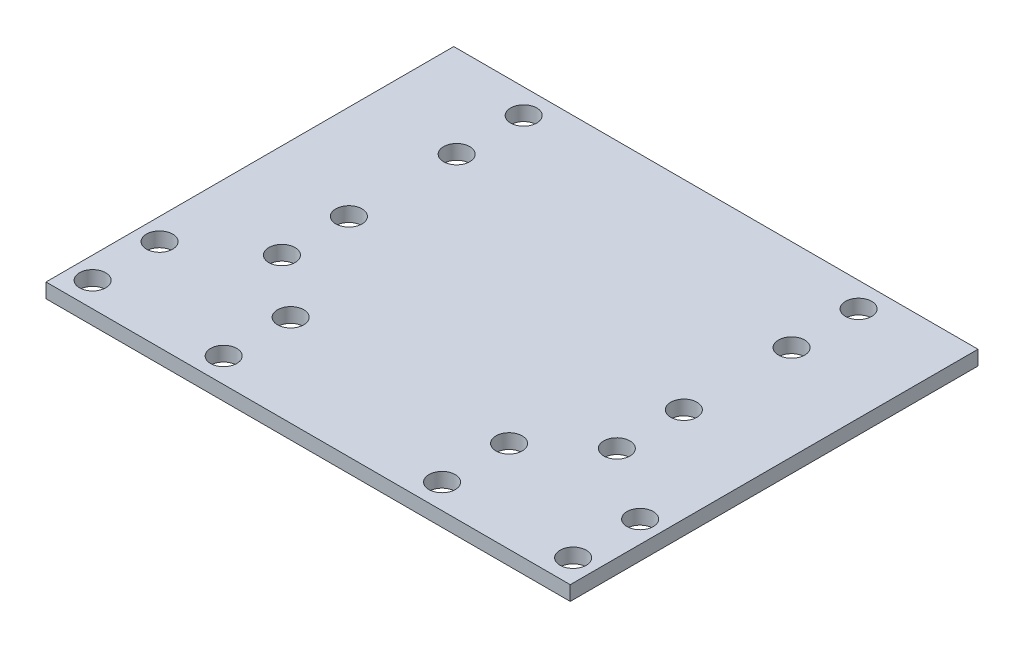
ISO-10303-21;
HEADER;
FILE_DESCRIPTION(('STEP AP214'),'2;1');
FILE_NAME('part.step','',(''),(''),'','','');
FILE_SCHEMA(('AUTOMOTIVE_DESIGN { 1 0 10303 214 1 1 1 1 }'));
ENDSEC;
DATA;
#1=APPLICATION_CONTEXT('core data for automotive mechanical design processes');
#2=APPLICATION_PROTOCOL_DEFINITION('international standard','automotive_design',2000,#1);
#3=PRODUCT_CONTEXT('',#1,'mechanical');
#4=PRODUCT('Part','Part','',(#3));
#5=PRODUCT_RELATED_PRODUCT_CATEGORY('part','',(#4));
#6=PRODUCT_DEFINITION_FORMATION('','',#4);
#7=PRODUCT_DEFINITION_CONTEXT('part definition',#1,'design');
#8=PRODUCT_DEFINITION('design','',#6,#7);
#9=PRODUCT_DEFINITION_SHAPE('','',#8);
#10=(LENGTH_UNIT() NAMED_UNIT(*) SI_UNIT(.MILLI.,.METRE.));
#11=(NAMED_UNIT(*) PLANE_ANGLE_UNIT() SI_UNIT($,.RADIAN.));
#12=(NAMED_UNIT(*) SI_UNIT($,.STERADIAN.) SOLID_ANGLE_UNIT());
#13=UNCERTAINTY_MEASURE_WITH_UNIT(LENGTH_MEASURE(1.E-05),#10,'distance_accuracy_value','');
#14=(GEOMETRIC_REPRESENTATION_CONTEXT(3) GLOBAL_UNCERTAINTY_ASSIGNED_CONTEXT((#13)) GLOBAL_UNIT_ASSIGNED_CONTEXT((#10,
#11,#12)) REPRESENTATION_CONTEXT('',''));
#15=CARTESIAN_POINT('',(0.,0.,0.));
#16=DIRECTION('',(0.,0.,1.));
#17=DIRECTION('',(1.,0.,0.));
#18=AXIS2_PLACEMENT_3D('',#15,#16,#17);
#19=CARTESIAN_POINT('',(-90.,5.,70.));
#20=DIRECTION('',(1.,0.,0.));
#21=DIRECTION('',(0.,0.,-1.));
#22=AXIS2_PLACEMENT_3D('',#19,#20,#21);
#23=PLANE('',#22);
#24=DIRECTION('',(0.,0.,1.));
#25=VECTOR('',#24,1.);
#26=CARTESIAN_POINT('',(-90.,0.,70.));
#27=LINE('',#26,#25);
#28=CARTESIAN_POINT('',(-90.,0.,-70.));
#29=VERTEX_POINT('',#28);
#30=CARTESIAN_POINT('',(-90.,0.,70.));
#31=VERTEX_POINT('',#30);
#32=EDGE_CURVE('E97',#29,#31,#27,.T.);
#33=ORIENTED_EDGE('',*,*,#32,.T.);
#34=DIRECTION('',(0.,-1.,0.));
#35=VECTOR('',#34,1.);
#36=CARTESIAN_POINT('',(-90.,5.,70.));
#37=LINE('',#36,#35);
#38=CARTESIAN_POINT('',(-90.,5.,70.));
#39=VERTEX_POINT('',#38);
#40=EDGE_CURVE('E11',#39,#31,#37,.T.);
#41=ORIENTED_EDGE('',*,*,#40,.F.);
#42=DIRECTION('',(0.,0.,1.));
#43=VECTOR('',#42,1.);
#44=CARTESIAN_POINT('',(-90.,5.,70.));
#45=LINE('',#44,#43);
#46=CARTESIAN_POINT('',(-90.,5.,-70.));
#47=VERTEX_POINT('',#46);
#48=EDGE_CURVE('E85',#47,#39,#45,.T.);
#49=ORIENTED_EDGE('',*,*,#48,.F.);
#50=DIRECTION('',(0.,-1.,0.));
#51=VECTOR('',#50,1.);
#52=CARTESIAN_POINT('',(-90.,5.,-70.));
#53=LINE('',#52,#51);
#54=EDGE_CURVE('E93',#47,#29,#53,.T.);
#55=ORIENTED_EDGE('',*,*,#54,.T.);
#56=EDGE_LOOP('',(#33,#41,#49,#55));
#57=FACE_BOUND('',#56,.T.);
#58=ADVANCED_FACE('F34',(#57),#23,.F.);
#59=CARTESIAN_POINT('',(90.,5.,70.));
#60=DIRECTION('',(0.,0.,-1.));
#61=DIRECTION('',(-1.,0.,0.));
#62=AXIS2_PLACEMENT_3D('',#59,#60,#61);
#63=PLANE('',#62);
#64=DIRECTION('',(1.,0.,0.));
#65=VECTOR('',#64,1.);
#66=CARTESIAN_POINT('',(90.,0.,70.));
#67=LINE('',#66,#65);
#68=CARTESIAN_POINT('',(90.,0.,70.));
#69=VERTEX_POINT('',#68);
#70=EDGE_CURVE('E89',#31,#69,#67,.T.);
#71=ORIENTED_EDGE('',*,*,#70,.T.);
#72=DIRECTION('',(0.,-1.,0.));
#73=VECTOR('',#72,1.);
#74=CARTESIAN_POINT('',(90.,5.,70.));
#75=LINE('',#74,#73);
#76=CARTESIAN_POINT('',(90.,5.,70.));
#77=VERTEX_POINT('',#76);
#78=EDGE_CURVE('E42',#77,#69,#75,.T.);
#79=ORIENTED_EDGE('',*,*,#78,.F.);
#80=DIRECTION('',(1.,0.,0.));
#81=VECTOR('',#80,1.);
#82=CARTESIAN_POINT('',(90.,5.,70.));
#83=LINE('',#82,#81);
#84=EDGE_CURVE('E80',#39,#77,#83,.T.);
#85=ORIENTED_EDGE('',*,*,#84,.F.);
#86=ORIENTED_EDGE('',*,*,#40,.T.);
#87=EDGE_LOOP('',(#71,#79,#85,#86));
#88=FACE_BOUND('',#87,.T.);
#89=ADVANCED_FACE('F88',(#88),#63,.F.);
#90=CARTESIAN_POINT('',(90.,5.,70.));
#91=DIRECTION('',(-1.,0.,0.));
#92=DIRECTION('',(0.,0.,1.));
#93=AXIS2_PLACEMENT_3D('',#90,#91,#92);
#94=PLANE('',#93);
#95=DIRECTION('',(0.,0.,-1.));
#96=VECTOR('',#95,1.);
#97=CARTESIAN_POINT('',(90.,0.,70.));
#98=LINE('',#97,#96);
#99=CARTESIAN_POINT('',(90.,0.,-70.));
#100=VERTEX_POINT('',#99);
#101=EDGE_CURVE('E67',#69,#100,#98,.T.);
#102=ORIENTED_EDGE('',*,*,#101,.T.);
#103=DIRECTION('',(0.,-1.,0.));
#104=VECTOR('',#103,1.);
#105=CARTESIAN_POINT('',(90.,5.,-70.));
#106=LINE('',#105,#104);
#107=CARTESIAN_POINT('',(90.,5.,-70.));
#108=VERTEX_POINT('',#107);
#109=EDGE_CURVE('E90',#108,#100,#106,.T.);
#110=ORIENTED_EDGE('',*,*,#109,.F.);
#111=DIRECTION('',(0.,0.,-1.));
#112=VECTOR('',#111,1.);
#113=CARTESIAN_POINT('',(90.,5.,70.));
#114=LINE('',#113,#112);
#115=EDGE_CURVE('E83',#77,#108,#114,.T.);
#116=ORIENTED_EDGE('',*,*,#115,.F.);
#117=ORIENTED_EDGE('',*,*,#78,.T.);
#118=EDGE_LOOP('',(#102,#110,#116,#117));
#119=FACE_BOUND('',#118,.T.);
#120=ADVANCED_FACE('F91',(#119),#94,.F.);
#121=CARTESIAN_POINT('',(90.,5.,-70.));
#122=DIRECTION('',(0.,0.,1.));
#123=DIRECTION('',(1.,0.,0.));
#124=AXIS2_PLACEMENT_3D('',#121,#122,#123);
#125=PLANE('',#124);
#126=DIRECTION('',(-1.,0.,0.));
#127=VECTOR('',#126,1.);
#128=CARTESIAN_POINT('',(90.,0.,-70.));
#129=LINE('',#128,#127);
#130=EDGE_CURVE('E73',#100,#29,#129,.T.);
#131=ORIENTED_EDGE('',*,*,#130,.T.);
#132=ORIENTED_EDGE('',*,*,#54,.F.);
#133=DIRECTION('',(-1.,0.,0.));
#134=VECTOR('',#133,1.);
#135=CARTESIAN_POINT('',(90.,5.,-70.));
#136=LINE('',#135,#134);
#137=EDGE_CURVE('E50',#108,#47,#136,.T.);
#138=ORIENTED_EDGE('',*,*,#137,.F.);
#139=ORIENTED_EDGE('',*,*,#109,.T.);
#140=EDGE_LOOP('',(#131,#132,#138,#139));
#141=FACE_BOUND('',#140,.T.);
#142=ADVANCED_FACE('F105',(#141),#125,.F.);
#143=CARTESIAN_POINT('',(0.,5.,0.));
#144=DIRECTION('',(0.,1.,0.));
#145=DIRECTION('',(0.,0.,1.));
#146=AXIS2_PLACEMENT_3D('',#143,#144,#145);
#147=PLANE('',#146);
#148=CARTESIAN_POINT('',(37.4999999999962,5.,38.5000000000041));
#149=DIRECTION('',(0.,1.,0.));
#150=DIRECTION('',(0.,0.,-1.));
#151=AXIS2_PLACEMENT_3D('',#148,#149,#150);
#152=CIRCLE('',#151,4.5);
#153=CARTESIAN_POINT('',(37.4999999999962,5.,34.0000000000041));
#154=VERTEX_POINT('',#153);
#155=EDGE_CURVE('E141',#154,#154,#152,.T.);
#156=ORIENTED_EDGE('',*,*,#155,.F.);
#157=EDGE_LOOP('',(#156));
#158=FACE_BOUND('',#157,.T.);
#159=CARTESIAN_POINT('',(-37.499999999996,5.,38.5000000000044));
#160=DIRECTION('',(0.,1.,0.));
#161=DIRECTION('',(0.,0.,1.));
#162=AXIS2_PLACEMENT_3D('',#159,#160,#161);
#163=CIRCLE('',#162,4.5);
#164=CARTESIAN_POINT('',(-37.499999999996,5.,43.0000000000044));
#165=VERTEX_POINT('',#164);
#166=EDGE_CURVE('E148',#165,#165,#163,.T.);
#167=ORIENTED_EDGE('',*,*,#166,.F.);
#168=EDGE_LOOP('',(#167));
#169=FACE_BOUND('',#168,.T.);
#170=CARTESIAN_POINT('',(-37.4999999999959,5.,61.4999999999985));
#171=DIRECTION('',(0.,1.,0.));
#172=DIRECTION('',(0.,0.,1.));
#173=AXIS2_PLACEMENT_3D('',#170,#171,#172);
#174=CIRCLE('',#173,4.5);
#175=CARTESIAN_POINT('',(-37.4999999999959,5.,65.9999999999985));
#176=VERTEX_POINT('',#175);
#177=EDGE_CURVE('E154',#176,#176,#174,.T.);
#178=ORIENTED_EDGE('',*,*,#177,.F.);
#179=EDGE_LOOP('',(#178));
#180=FACE_BOUND('',#179,.T.);
#181=CARTESIAN_POINT('',(-82.5000000000001,5.,61.5));
#182=DIRECTION('',(0.,1.,0.));
#183=DIRECTION('',(0.,0.,1.));
#184=AXIS2_PLACEMENT_3D('',#181,#182,#183);
#185=CIRCLE('',#184,4.50000000000001);
#186=CARTESIAN_POINT('',(-82.5000000000001,5.,66.0000000000001));
#187=VERTEX_POINT('',#186);
#188=EDGE_CURVE('E160',#187,#187,#185,.T.);
#189=ORIENTED_EDGE('',*,*,#188,.F.);
#190=EDGE_LOOP('',(#189));
#191=FACE_BOUND('',#190,.T.);
#192=CARTESIAN_POINT('',(-82.5000000000027,5.,38.5000000000025));
#193=DIRECTION('',(0.,1.,0.));
#194=DIRECTION('',(0.,0.,1.));
#195=AXIS2_PLACEMENT_3D('',#192,#193,#194);
#196=CIRCLE('',#195,4.50000000000001);
#197=CARTESIAN_POINT('',(-82.5000000000027,5.,43.0000000000025));
#198=VERTEX_POINT('',#197);
#199=EDGE_CURVE('E117',#198,#198,#196,.T.);
#200=ORIENTED_EDGE('',*,*,#199,.F.);
#201=EDGE_LOOP('',(#200));
#202=FACE_BOUND('',#201,.T.);
#203=CARTESIAN_POINT('',(-57.4999999999997,5.,21.4999999999245));
#204=DIRECTION('',(0.,1.,0.));
#205=DIRECTION('',(0.,0.,1.));
#206=AXIS2_PLACEMENT_3D('',#203,#204,#205);
#207=CIRCLE('',#206,4.5);
#208=CARTESIAN_POINT('',(-57.4999999999997,5.,25.9999999999245));
#209=VERTEX_POINT('',#208);
#210=EDGE_CURVE('E124',#209,#209,#207,.T.);
#211=ORIENTED_EDGE('',*,*,#210,.F.);
#212=EDGE_LOOP('',(#211));
#213=FACE_BOUND('',#212,.T.);
#214=CARTESIAN_POINT('',(-57.5000000000031,5.,-1.49999999999952));
#215=DIRECTION('',(0.,1.,0.));
#216=DIRECTION('',(0.,0.,1.));
#217=AXIS2_PLACEMENT_3D('',#214,#215,#216);
#218=CIRCLE('',#217,4.5);
#219=CARTESIAN_POINT('',(-57.5000000000031,5.,3.00000000000048));
#220=VERTEX_POINT('',#219);
#221=EDGE_CURVE('E130',#220,#220,#218,.T.);
#222=ORIENTED_EDGE('',*,*,#221,.F.);
#223=EDGE_LOOP('',(#222));
#224=FACE_BOUND('',#223,.T.);
#225=CARTESIAN_POINT('',(-57.5000000000024,5.,-38.4999999999094));
#226=DIRECTION('',(0.,1.,0.));
#227=DIRECTION('',(0.,0.,1.));
#228=AXIS2_PLACEMENT_3D('',#225,#226,#227);
#229=CIRCLE('',#228,4.5);
#230=CARTESIAN_POINT('',(-57.5000000000024,5.,-33.9999999999094));
#231=VERTEX_POINT('',#230);
#232=EDGE_CURVE('E136',#231,#231,#229,.T.);
#233=ORIENTED_EDGE('',*,*,#232,.F.);
#234=EDGE_LOOP('',(#233));
#235=FACE_BOUND('',#234,.T.);
#236=CARTESIAN_POINT('',(37.4999999999964,5.,61.4999999999983));
#237=DIRECTION('',(0.,1.,0.));
#238=DIRECTION('',(0.,0.,-1.));
#239=AXIS2_PLACEMENT_3D('',#236,#237,#238);
#240=CIRCLE('',#239,4.5);
#241=CARTESIAN_POINT('',(37.4999999999964,5.,56.9999999999983));
#242=VERTEX_POINT('',#241);
#243=EDGE_CURVE('E201',#242,#242,#240,.T.);
#244=ORIENTED_EDGE('',*,*,#243,.F.);
#245=EDGE_LOOP('',(#244));
#246=FACE_BOUND('',#245,.T.);
#247=CARTESIAN_POINT('',(82.5000000000005,5.,61.4999999999994));
#248=DIRECTION('',(0.,1.,0.));
#249=DIRECTION('',(0.,0.,-1.));
#250=AXIS2_PLACEMENT_3D('',#247,#248,#249);
#251=CIRCLE('',#250,4.50000000000001);
#252=CARTESIAN_POINT('',(82.5000000000005,5.,56.9999999999994));
#253=VERTEX_POINT('',#252);
#254=EDGE_CURVE('E195',#253,#253,#251,.T.);
#255=ORIENTED_EDGE('',*,*,#254,.F.);
#256=EDGE_LOOP('',(#255));
#257=FACE_BOUND('',#256,.T.);
#258=CARTESIAN_POINT('',(82.5000000000029,5.,38.5000000000018));
#259=DIRECTION('',(0.,1.,0.));
#260=DIRECTION('',(0.,0.,-1.));
#261=AXIS2_PLACEMENT_3D('',#258,#259,#260);
#262=CIRCLE('',#261,4.50000000000001);
#263=CARTESIAN_POINT('',(82.5000000000029,5.,34.0000000000018));
#264=VERTEX_POINT('',#263);
#265=EDGE_CURVE('E189',#264,#264,#262,.T.);
#266=ORIENTED_EDGE('',*,*,#265,.F.);
#267=EDGE_LOOP('',(#266));
#268=FACE_BOUND('',#267,.T.);
#269=CARTESIAN_POINT('',(57.4999999999999,5.,21.4999999999241));
#270=DIRECTION('',(0.,1.,0.));
#271=DIRECTION('',(0.,0.,-1.));
#272=AXIS2_PLACEMENT_3D('',#269,#270,#271);
#273=CIRCLE('',#272,4.5);
#274=CARTESIAN_POINT('',(57.4999999999999,5.,16.9999999999241));
#275=VERTEX_POINT('',#274);
#276=EDGE_CURVE('E183',#275,#275,#273,.T.);
#277=ORIENTED_EDGE('',*,*,#276,.F.);
#278=EDGE_LOOP('',(#277));
#279=FACE_BOUND('',#278,.T.);
#280=CARTESIAN_POINT('',(57.500000000003,5.,-1.49999999999997));
#281=DIRECTION('',(0.,1.,0.));
#282=DIRECTION('',(0.,0.,-1.));
#283=AXIS2_PLACEMENT_3D('',#280,#281,#282);
#284=CIRCLE('',#283,4.5);
#285=CARTESIAN_POINT('',(57.500000000003,5.,-5.99999999999996));
#286=VERTEX_POINT('',#285);
#287=EDGE_CURVE('E177',#286,#286,#284,.T.);
#288=ORIENTED_EDGE('',*,*,#287,.F.);
#289=EDGE_LOOP('',(#288));
#290=FACE_BOUND('',#289,.T.);
#291=CARTESIAN_POINT('',(57.5000000000021,5.,-38.4999999999099));
#292=DIRECTION('',(0.,1.,0.));
#293=DIRECTION('',(0.,0.,-1.));
#294=AXIS2_PLACEMENT_3D('',#291,#292,#293);
#295=CIRCLE('',#294,4.5);
#296=CARTESIAN_POINT('',(57.5000000000021,5.,-42.9999999999099));
#297=VERTEX_POINT('',#296);
#298=EDGE_CURVE('E171',#297,#297,#295,.T.);
#299=ORIENTED_EDGE('',*,*,#298,.F.);
#300=EDGE_LOOP('',(#299));
#301=FACE_BOUND('',#300,.T.);
#302=CARTESIAN_POINT('',(57.4999999999995,5.,-61.5000000000005));
#303=DIRECTION('',(0.,1.,0.));
#304=DIRECTION('',(0.,0.,-1.));
#305=AXIS2_PLACEMENT_3D('',#302,#303,#304);
#306=CIRCLE('',#305,4.5);
#307=CARTESIAN_POINT('',(57.4999999999995,5.,-66.0000000000005));
#308=VERTEX_POINT('',#307);
#309=EDGE_CURVE('E165',#308,#308,#306,.T.);
#310=ORIENTED_EDGE('',*,*,#309,.F.);
#311=EDGE_LOOP('',(#310));
#312=FACE_BOUND('',#311,.T.);
#313=CARTESIAN_POINT('',(-57.5,5.,-61.5));
#314=DIRECTION('',(0.,1.,0.));
#315=DIRECTION('',(0.,0.,1.));
#316=AXIS2_PLACEMENT_3D('',#313,#314,#315);
#317=CIRCLE('',#316,4.5);
#318=CARTESIAN_POINT('',(-57.5,5.,-57.));
#319=VERTEX_POINT('',#318);
#320=EDGE_CURVE('E111',#319,#319,#317,.T.);
#321=ORIENTED_EDGE('',*,*,#320,.F.);
#322=EDGE_LOOP('',(#321));
#323=FACE_BOUND('',#322,.T.);
#324=ORIENTED_EDGE('',*,*,#48,.T.);
#325=ORIENTED_EDGE('',*,*,#84,.T.);
#326=ORIENTED_EDGE('',*,*,#115,.T.);
#327=ORIENTED_EDGE('',*,*,#137,.T.);
#328=EDGE_LOOP('',(#324,#325,#326,#327));
#329=FACE_BOUND('',#328,.T.);
#330=ADVANCED_FACE('F81',(#158,#169,#180,#191,#202,#213,#224,#235,#246,#257,#268,#279,#290,#301,
#312,#323,#329),#147,.T.);
#331=CARTESIAN_POINT('',(0.,0.,0.));
#332=DIRECTION('',(0.,1.,0.));
#333=DIRECTION('',(0.,0.,1.));
#334=AXIS2_PLACEMENT_3D('',#331,#332,#333);
#335=PLANE('',#334);
#336=CARTESIAN_POINT('',(37.4999999999962,0.,38.5000000000041));
#337=DIRECTION('',(0.,1.,0.));
#338=DIRECTION('',(0.,0.,-1.));
#339=AXIS2_PLACEMENT_3D('',#336,#337,#338);
#340=CIRCLE('',#339,4.5);
#341=CARTESIAN_POINT('',(37.4999999999962,0.,34.0000000000041));
#342=VERTEX_POINT('',#341);
#343=EDGE_CURVE('E144',#342,#342,#340,.T.);
#344=ORIENTED_EDGE('',*,*,#343,.T.);
#345=EDGE_LOOP('',(#344));
#346=FACE_BOUND('',#345,.T.);
#347=CARTESIAN_POINT('',(-37.499999999996,0.,38.5000000000044));
#348=DIRECTION('',(0.,1.,0.));
#349=DIRECTION('',(0.,0.,1.));
#350=AXIS2_PLACEMENT_3D('',#347,#348,#349);
#351=CIRCLE('',#350,4.5);
#352=CARTESIAN_POINT('',(-37.499999999996,0.,43.0000000000044));
#353=VERTEX_POINT('',#352);
#354=EDGE_CURVE('E151',#353,#353,#351,.T.);
#355=ORIENTED_EDGE('',*,*,#354,.T.);
#356=EDGE_LOOP('',(#355));
#357=FACE_BOUND('',#356,.T.);
#358=CARTESIAN_POINT('',(-37.4999999999959,0.,61.4999999999985));
#359=DIRECTION('',(0.,1.,0.));
#360=DIRECTION('',(0.,0.,1.));
#361=AXIS2_PLACEMENT_3D('',#358,#359,#360);
#362=CIRCLE('',#361,4.5);
#363=CARTESIAN_POINT('',(-37.4999999999959,0.,65.9999999999985));
#364=VERTEX_POINT('',#363);
#365=EDGE_CURVE('E157',#364,#364,#362,.T.);
#366=ORIENTED_EDGE('',*,*,#365,.T.);
#367=EDGE_LOOP('',(#366));
#368=FACE_BOUND('',#367,.T.);
#369=CARTESIAN_POINT('',(-82.5000000000001,0.,61.5));
#370=DIRECTION('',(0.,1.,0.));
#371=DIRECTION('',(0.,0.,1.));
#372=AXIS2_PLACEMENT_3D('',#369,#370,#371);
#373=CIRCLE('',#372,4.50000000000001);
#374=CARTESIAN_POINT('',(-82.5000000000001,0.,66.0000000000001));
#375=VERTEX_POINT('',#374);
#376=EDGE_CURVE('E121',#375,#375,#373,.T.);
#377=ORIENTED_EDGE('',*,*,#376,.T.);
#378=EDGE_LOOP('',(#377));
#379=FACE_BOUND('',#378,.T.);
#380=CARTESIAN_POINT('',(-82.5000000000027,0.,38.5000000000025));
#381=DIRECTION('',(0.,1.,0.));
#382=DIRECTION('',(0.,0.,1.));
#383=AXIS2_PLACEMENT_3D('',#380,#381,#382);
#384=CIRCLE('',#383,4.50000000000001);
#385=CARTESIAN_POINT('',(-82.5000000000027,0.,43.0000000000025));
#386=VERTEX_POINT('',#385);
#387=EDGE_CURVE('E120',#386,#386,#384,.T.);
#388=ORIENTED_EDGE('',*,*,#387,.T.);
#389=EDGE_LOOP('',(#388));
#390=FACE_BOUND('',#389,.T.);
#391=CARTESIAN_POINT('',(-57.4999999999997,0.,21.4999999999245));
#392=DIRECTION('',(0.,1.,0.));
#393=DIRECTION('',(0.,0.,1.));
#394=AXIS2_PLACEMENT_3D('',#391,#392,#393);
#395=CIRCLE('',#394,4.5);
#396=CARTESIAN_POINT('',(-57.4999999999997,0.,25.9999999999245));
#397=VERTEX_POINT('',#396);
#398=EDGE_CURVE('E127',#397,#397,#395,.T.);
#399=ORIENTED_EDGE('',*,*,#398,.T.);
#400=EDGE_LOOP('',(#399));
#401=FACE_BOUND('',#400,.T.);
#402=CARTESIAN_POINT('',(-57.5000000000031,0.,-1.49999999999952));
#403=DIRECTION('',(0.,1.,0.));
#404=DIRECTION('',(0.,0.,1.));
#405=AXIS2_PLACEMENT_3D('',#402,#403,#404);
#406=CIRCLE('',#405,4.5);
#407=CARTESIAN_POINT('',(-57.5000000000031,0.,3.00000000000048));
#408=VERTEX_POINT('',#407);
#409=EDGE_CURVE('E133',#408,#408,#406,.T.);
#410=ORIENTED_EDGE('',*,*,#409,.T.);
#411=EDGE_LOOP('',(#410));
#412=FACE_BOUND('',#411,.T.);
#413=CARTESIAN_POINT('',(-57.5000000000024,0.,-38.4999999999094));
#414=DIRECTION('',(0.,1.,0.));
#415=DIRECTION('',(0.,0.,1.));
#416=AXIS2_PLACEMENT_3D('',#413,#414,#415);
#417=CIRCLE('',#416,4.5);
#418=CARTESIAN_POINT('',(-57.5000000000024,0.,-33.9999999999094));
#419=VERTEX_POINT('',#418);
#420=EDGE_CURVE('E114',#419,#419,#417,.T.);
#421=ORIENTED_EDGE('',*,*,#420,.T.);
#422=EDGE_LOOP('',(#421));
#423=FACE_BOUND('',#422,.T.);
#424=CARTESIAN_POINT('',(37.4999999999964,0.,61.4999999999983));
#425=DIRECTION('',(0.,1.,0.));
#426=DIRECTION('',(0.,0.,-1.));
#427=AXIS2_PLACEMENT_3D('',#424,#425,#426);
#428=CIRCLE('',#427,4.5);
#429=CARTESIAN_POINT('',(37.4999999999964,0.,56.9999999999983));
#430=VERTEX_POINT('',#429);
#431=EDGE_CURVE('E145',#430,#430,#428,.T.);
#432=ORIENTED_EDGE('',*,*,#431,.T.);
#433=EDGE_LOOP('',(#432));
#434=FACE_BOUND('',#433,.T.);
#435=CARTESIAN_POINT('',(82.5000000000005,0.,61.4999999999994));
#436=DIRECTION('',(0.,1.,0.));
#437=DIRECTION('',(0.,0.,-1.));
#438=AXIS2_PLACEMENT_3D('',#435,#436,#437);
#439=CIRCLE('',#438,4.50000000000001);
#440=CARTESIAN_POINT('',(82.5000000000005,0.,56.9999999999994));
#441=VERTEX_POINT('',#440);
#442=EDGE_CURVE('E198',#441,#441,#439,.T.);
#443=ORIENTED_EDGE('',*,*,#442,.T.);
#444=EDGE_LOOP('',(#443));
#445=FACE_BOUND('',#444,.T.);
#446=CARTESIAN_POINT('',(82.5000000000029,0.,38.5000000000018));
#447=DIRECTION('',(0.,1.,0.));
#448=DIRECTION('',(0.,0.,-1.));
#449=AXIS2_PLACEMENT_3D('',#446,#447,#448);
#450=CIRCLE('',#449,4.50000000000001);
#451=CARTESIAN_POINT('',(82.5000000000029,0.,34.0000000000018));
#452=VERTEX_POINT('',#451);
#453=EDGE_CURVE('E192',#452,#452,#450,.T.);
#454=ORIENTED_EDGE('',*,*,#453,.T.);
#455=EDGE_LOOP('',(#454));
#456=FACE_BOUND('',#455,.T.);
#457=CARTESIAN_POINT('',(57.4999999999999,0.,21.4999999999241));
#458=DIRECTION('',(0.,1.,0.));
#459=DIRECTION('',(0.,0.,-1.));
#460=AXIS2_PLACEMENT_3D('',#457,#458,#459);
#461=CIRCLE('',#460,4.5);
#462=CARTESIAN_POINT('',(57.4999999999999,0.,16.9999999999241));
#463=VERTEX_POINT('',#462);
#464=EDGE_CURVE('E186',#463,#463,#461,.T.);
#465=ORIENTED_EDGE('',*,*,#464,.T.);
#466=EDGE_LOOP('',(#465));
#467=FACE_BOUND('',#466,.T.);
#468=CARTESIAN_POINT('',(57.500000000003,0.,-1.49999999999997));
#469=DIRECTION('',(0.,1.,0.));
#470=DIRECTION('',(0.,0.,-1.));
#471=AXIS2_PLACEMENT_3D('',#468,#469,#470);
#472=CIRCLE('',#471,4.5);
#473=CARTESIAN_POINT('',(57.500000000003,0.,-5.99999999999996));
#474=VERTEX_POINT('',#473);
#475=EDGE_CURVE('E180',#474,#474,#472,.T.);
#476=ORIENTED_EDGE('',*,*,#475,.T.);
#477=EDGE_LOOP('',(#476));
#478=FACE_BOUND('',#477,.T.);
#479=CARTESIAN_POINT('',(57.5000000000021,0.,-38.4999999999099));
#480=DIRECTION('',(0.,1.,0.));
#481=DIRECTION('',(0.,0.,-1.));
#482=AXIS2_PLACEMENT_3D('',#479,#480,#481);
#483=CIRCLE('',#482,4.5);
#484=CARTESIAN_POINT('',(57.5000000000021,0.,-42.9999999999099));
#485=VERTEX_POINT('',#484);
#486=EDGE_CURVE('E174',#485,#485,#483,.T.);
#487=ORIENTED_EDGE('',*,*,#486,.T.);
#488=EDGE_LOOP('',(#487));
#489=FACE_BOUND('',#488,.T.);
#490=CARTESIAN_POINT('',(57.4999999999995,0.,-61.5000000000005));
#491=DIRECTION('',(0.,1.,0.));
#492=DIRECTION('',(0.,0.,-1.));
#493=AXIS2_PLACEMENT_3D('',#490,#491,#492);
#494=CIRCLE('',#493,4.5);
#495=CARTESIAN_POINT('',(57.4999999999995,0.,-66.0000000000005));
#496=VERTEX_POINT('',#495);
#497=EDGE_CURVE('E168',#496,#496,#494,.T.);
#498=ORIENTED_EDGE('',*,*,#497,.T.);
#499=EDGE_LOOP('',(#498));
#500=FACE_BOUND('',#499,.T.);
#501=CARTESIAN_POINT('',(-57.5,0.,-61.5));
#502=DIRECTION('',(0.,1.,0.));
#503=DIRECTION('',(0.,0.,1.));
#504=AXIS2_PLACEMENT_3D('',#501,#502,#503);
#505=CIRCLE('',#504,4.5);
#506=CARTESIAN_POINT('',(-57.5,0.,-57.));
#507=VERTEX_POINT('',#506);
#508=EDGE_CURVE('E100',#507,#507,#505,.T.);
#509=ORIENTED_EDGE('',*,*,#508,.T.);
#510=EDGE_LOOP('',(#509));
#511=FACE_BOUND('',#510,.T.);
#512=ORIENTED_EDGE('',*,*,#32,.F.);
#513=ORIENTED_EDGE('',*,*,#130,.F.);
#514=ORIENTED_EDGE('',*,*,#101,.F.);
#515=ORIENTED_EDGE('',*,*,#70,.F.);
#516=EDGE_LOOP('',(#512,#513,#514,#515));
#517=FACE_BOUND('',#516,.T.);
#518=ADVANCED_FACE('F108',(#346,#357,#368,#379,#390,#401,#412,#423,#434,#445,#456,#467,#478,
#489,#500,#511,#517),#335,.F.);
#519=CARTESIAN_POINT('',(-57.5,0.,-61.5));
#520=DIRECTION('',(0.,1.,0.));
#521=DIRECTION('',(0.,0.,1.));
#522=AXIS2_PLACEMENT_3D('',#519,#520,#521);
#523=CYLINDRICAL_SURFACE('',#522,4.5);
#524=ORIENTED_EDGE('',*,*,#508,.F.);
#525=EDGE_LOOP('',(#524));
#526=FACE_BOUND('',#525,.T.);
#527=ORIENTED_EDGE('',*,*,#320,.T.);
#528=EDGE_LOOP('',(#527));
#529=FACE_BOUND('',#528,.T.);
#530=ADVANCED_FACE('F235',(#526,#529),#523,.F.);
#531=CARTESIAN_POINT('',(57.4999999999995,0.,-61.5000000000005));
#532=DIRECTION('',(0.,1.,0.));
#533=DIRECTION('',(0.,0.,1.));
#534=AXIS2_PLACEMENT_3D('',#531,#532,#533);
#535=CYLINDRICAL_SURFACE('',#534,4.5);
#536=ORIENTED_EDGE('',*,*,#497,.F.);
#537=EDGE_LOOP('',(#536));
#538=FACE_BOUND('',#537,.T.);
#539=ORIENTED_EDGE('',*,*,#309,.T.);
#540=EDGE_LOOP('',(#539));
#541=FACE_BOUND('',#540,.T.);
#542=ADVANCED_FACE('F237',(#538,#541),#535,.F.);
#543=CARTESIAN_POINT('',(57.5000000000021,0.,-38.4999999999099));
#544=DIRECTION('',(0.,1.,0.));
#545=DIRECTION('',(0.,0.,1.));
#546=AXIS2_PLACEMENT_3D('',#543,#544,#545);
#547=CYLINDRICAL_SURFACE('',#546,4.5);
#548=ORIENTED_EDGE('',*,*,#486,.F.);
#549=EDGE_LOOP('',(#548));
#550=FACE_BOUND('',#549,.T.);
#551=ORIENTED_EDGE('',*,*,#298,.T.);
#552=EDGE_LOOP('',(#551));
#553=FACE_BOUND('',#552,.T.);
#554=ADVANCED_FACE('F244',(#550,#553),#547,.F.);
#555=CARTESIAN_POINT('',(57.500000000003,0.,-1.49999999999997));
#556=DIRECTION('',(0.,1.,0.));
#557=DIRECTION('',(0.,0.,1.));
#558=AXIS2_PLACEMENT_3D('',#555,#556,#557);
#559=CYLINDRICAL_SURFACE('',#558,4.5);
#560=ORIENTED_EDGE('',*,*,#475,.F.);
#561=EDGE_LOOP('',(#560));
#562=FACE_BOUND('',#561,.T.);
#563=ORIENTED_EDGE('',*,*,#287,.T.);
#564=EDGE_LOOP('',(#563));
#565=FACE_BOUND('',#564,.T.);
#566=ADVANCED_FACE('F294',(#562,#565),#559,.F.);
#567=CARTESIAN_POINT('',(57.4999999999999,0.,21.4999999999241));
#568=DIRECTION('',(0.,1.,0.));
#569=DIRECTION('',(0.,0.,1.));
#570=AXIS2_PLACEMENT_3D('',#567,#568,#569);
#571=CYLINDRICAL_SURFACE('',#570,4.5);
#572=ORIENTED_EDGE('',*,*,#464,.F.);
#573=EDGE_LOOP('',(#572));
#574=FACE_BOUND('',#573,.T.);
#575=ORIENTED_EDGE('',*,*,#276,.T.);
#576=EDGE_LOOP('',(#575));
#577=FACE_BOUND('',#576,.T.);
#578=ADVANCED_FACE('F304',(#574,#577),#571,.F.);
#579=CARTESIAN_POINT('',(82.5000000000029,0.,38.5000000000018));
#580=DIRECTION('',(0.,1.,0.));
#581=DIRECTION('',(0.,0.,1.));
#582=AXIS2_PLACEMENT_3D('',#579,#580,#581);
#583=CYLINDRICAL_SURFACE('',#582,4.50000000000001);
#584=ORIENTED_EDGE('',*,*,#453,.F.);
#585=EDGE_LOOP('',(#584));
#586=FACE_BOUND('',#585,.T.);
#587=ORIENTED_EDGE('',*,*,#265,.T.);
#588=EDGE_LOOP('',(#587));
#589=FACE_BOUND('',#588,.T.);
#590=ADVANCED_FACE('F314',(#586,#589),#583,.F.);
#591=CARTESIAN_POINT('',(82.5000000000005,0.,61.4999999999994));
#592=DIRECTION('',(0.,1.,0.));
#593=DIRECTION('',(0.,0.,1.));
#594=AXIS2_PLACEMENT_3D('',#591,#592,#593);
#595=CYLINDRICAL_SURFACE('',#594,4.50000000000001);
#596=ORIENTED_EDGE('',*,*,#442,.F.);
#597=EDGE_LOOP('',(#596));
#598=FACE_BOUND('',#597,.T.);
#599=ORIENTED_EDGE('',*,*,#254,.T.);
#600=EDGE_LOOP('',(#599));
#601=FACE_BOUND('',#600,.T.);
#602=ADVANCED_FACE('F213',(#598,#601),#595,.F.);
#603=CARTESIAN_POINT('',(37.4999999999964,0.,61.4999999999983));
#604=DIRECTION('',(0.,1.,0.));
#605=DIRECTION('',(0.,0.,1.));
#606=AXIS2_PLACEMENT_3D('',#603,#604,#605);
#607=CYLINDRICAL_SURFACE('',#606,4.5);
#608=ORIENTED_EDGE('',*,*,#431,.F.);
#609=EDGE_LOOP('',(#608));
#610=FACE_BOUND('',#609,.T.);
#611=ORIENTED_EDGE('',*,*,#243,.T.);
#612=EDGE_LOOP('',(#611));
#613=FACE_BOUND('',#612,.T.);
#614=ADVANCED_FACE('F209',(#610,#613),#607,.F.);
#615=CARTESIAN_POINT('',(-57.5000000000024,0.,-38.4999999999094));
#616=DIRECTION('',(0.,1.,0.));
#617=DIRECTION('',(0.,0.,1.));
#618=AXIS2_PLACEMENT_3D('',#615,#616,#617);
#619=CYLINDRICAL_SURFACE('',#618,4.5);
#620=ORIENTED_EDGE('',*,*,#420,.F.);
#621=EDGE_LOOP('',(#620));
#622=FACE_BOUND('',#621,.T.);
#623=ORIENTED_EDGE('',*,*,#232,.T.);
#624=EDGE_LOOP('',(#623));
#625=FACE_BOUND('',#624,.T.);
#626=ADVANCED_FACE('F212',(#622,#625),#619,.F.);
#627=CARTESIAN_POINT('',(-57.5000000000031,0.,-1.49999999999952));
#628=DIRECTION('',(0.,1.,0.));
#629=DIRECTION('',(0.,0.,1.));
#630=AXIS2_PLACEMENT_3D('',#627,#628,#629);
#631=CYLINDRICAL_SURFACE('',#630,4.5);
#632=ORIENTED_EDGE('',*,*,#409,.F.);
#633=EDGE_LOOP('',(#632));
#634=FACE_BOUND('',#633,.T.);
#635=ORIENTED_EDGE('',*,*,#221,.T.);
#636=EDGE_LOOP('',(#635));
#637=FACE_BOUND('',#636,.T.);
#638=ADVANCED_FACE('F348',(#634,#637),#631,.F.);
#639=CARTESIAN_POINT('',(-57.4999999999997,0.,21.4999999999245));
#640=DIRECTION('',(0.,1.,0.));
#641=DIRECTION('',(0.,0.,1.));
#642=AXIS2_PLACEMENT_3D('',#639,#640,#641);
#643=CYLINDRICAL_SURFACE('',#642,4.5);
#644=ORIENTED_EDGE('',*,*,#398,.F.);
#645=EDGE_LOOP('',(#644));
#646=FACE_BOUND('',#645,.T.);
#647=ORIENTED_EDGE('',*,*,#210,.T.);
#648=EDGE_LOOP('',(#647));
#649=FACE_BOUND('',#648,.T.);
#650=ADVANCED_FACE('F358',(#646,#649),#643,.F.);
#651=CARTESIAN_POINT('',(-82.5000000000027,0.,38.5000000000025));
#652=DIRECTION('',(0.,1.,0.));
#653=DIRECTION('',(0.,0.,1.));
#654=AXIS2_PLACEMENT_3D('',#651,#652,#653);
#655=CYLINDRICAL_SURFACE('',#654,4.50000000000001);
#656=ORIENTED_EDGE('',*,*,#387,.F.);
#657=EDGE_LOOP('',(#656));
#658=FACE_BOUND('',#657,.T.);
#659=ORIENTED_EDGE('',*,*,#199,.T.);
#660=EDGE_LOOP('',(#659));
#661=FACE_BOUND('',#660,.T.);
#662=ADVANCED_FACE('F368',(#658,#661),#655,.F.);
#663=CARTESIAN_POINT('',(-82.5000000000001,0.,61.5));
#664=DIRECTION('',(0.,1.,0.));
#665=DIRECTION('',(0.,0.,1.));
#666=AXIS2_PLACEMENT_3D('',#663,#664,#665);
#667=CYLINDRICAL_SURFACE('',#666,4.50000000000001);
#668=ORIENTED_EDGE('',*,*,#376,.F.);
#669=EDGE_LOOP('',(#668));
#670=FACE_BOUND('',#669,.T.);
#671=ORIENTED_EDGE('',*,*,#188,.T.);
#672=EDGE_LOOP('',(#671));
#673=FACE_BOUND('',#672,.T.);
#674=ADVANCED_FACE('F378',(#670,#673),#667,.F.);
#675=CARTESIAN_POINT('',(-37.4999999999959,0.,61.4999999999985));
#676=DIRECTION('',(0.,1.,0.));
#677=DIRECTION('',(0.,0.,1.));
#678=AXIS2_PLACEMENT_3D('',#675,#676,#677);
#679=CYLINDRICAL_SURFACE('',#678,4.5);
#680=ORIENTED_EDGE('',*,*,#365,.F.);
#681=EDGE_LOOP('',(#680));
#682=FACE_BOUND('',#681,.T.);
#683=ORIENTED_EDGE('',*,*,#177,.T.);
#684=EDGE_LOOP('',(#683));
#685=FACE_BOUND('',#684,.T.);
#686=ADVANCED_FACE('F387',(#682,#685),#679,.F.);
#687=CARTESIAN_POINT('',(-37.499999999996,0.,38.5000000000044));
#688=DIRECTION('',(0.,1.,0.));
#689=DIRECTION('',(0.,0.,1.));
#690=AXIS2_PLACEMENT_3D('',#687,#688,#689);
#691=CYLINDRICAL_SURFACE('',#690,4.5);
#692=ORIENTED_EDGE('',*,*,#354,.F.);
#693=EDGE_LOOP('',(#692));
#694=FACE_BOUND('',#693,.T.);
#695=ORIENTED_EDGE('',*,*,#166,.T.);
#696=EDGE_LOOP('',(#695));
#697=FACE_BOUND('',#696,.T.);
#698=ADVANCED_FACE('F397',(#694,#697),#691,.F.);
#699=CARTESIAN_POINT('',(37.4999999999962,0.,38.5000000000041));
#700=DIRECTION('',(0.,1.,0.));
#701=DIRECTION('',(0.,0.,1.));
#702=AXIS2_PLACEMENT_3D('',#699,#700,#701);
#703=CYLINDRICAL_SURFACE('',#702,4.5);
#704=ORIENTED_EDGE('',*,*,#343,.F.);
#705=EDGE_LOOP('',(#704));
#706=FACE_BOUND('',#705,.T.);
#707=ORIENTED_EDGE('',*,*,#155,.T.);
#708=EDGE_LOOP('',(#707));
#709=FACE_BOUND('',#708,.T.);
#710=ADVANCED_FACE('F407',(#706,#709),#703,.F.);
#711=CLOSED_SHELL('',(#58,#89,#120,#142,#330,#518,#530,#542,#554,#566,#578,#590,#602,#614,#626,
#638,#650,#662,#674,#686,#698,#710));
#712=MANIFOLD_SOLID_BREP('B2',#711);
#713=ADVANCED_BREP_SHAPE_REPRESENTATION('',(#18,#712),#14);
#714=SHAPE_DEFINITION_REPRESENTATION(#9,#713);
ENDSEC;
END-ISO-10303-21;
